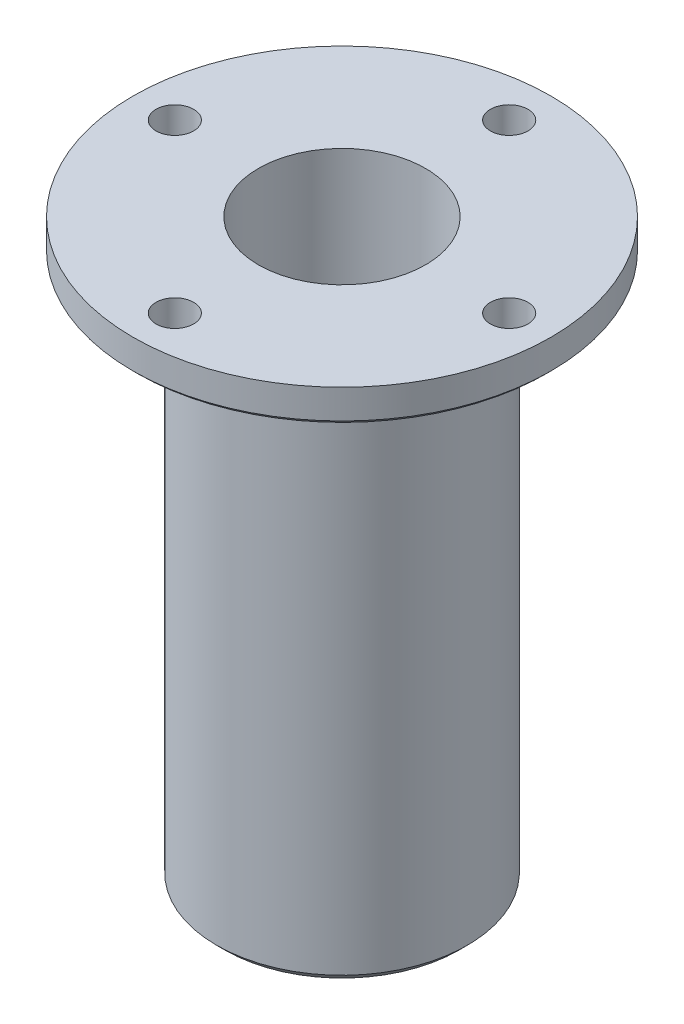
ISO-10303-21;
HEADER;
FILE_DESCRIPTION(('STEP AP214'),'2;1');
FILE_NAME('part.step','',(''),(''),'','','');
FILE_SCHEMA(('AUTOMOTIVE_DESIGN { 1 0 10303 214 1 1 1 1 }'));
ENDSEC;
DATA;
#1=APPLICATION_CONTEXT('core data for automotive mechanical design processes');
#2=APPLICATION_PROTOCOL_DEFINITION('international standard','automotive_design',2000,#1);
#3=PRODUCT_CONTEXT('',#1,'mechanical');
#4=PRODUCT('Part','Part','',(#3));
#5=PRODUCT_RELATED_PRODUCT_CATEGORY('part','',(#4));
#6=PRODUCT_DEFINITION_FORMATION('','',#4);
#7=PRODUCT_DEFINITION_CONTEXT('part definition',#1,'design');
#8=PRODUCT_DEFINITION('design','',#6,#7);
#9=PRODUCT_DEFINITION_SHAPE('','',#8);
#10=(LENGTH_UNIT() NAMED_UNIT(*) SI_UNIT(.MILLI.,.METRE.));
#11=(NAMED_UNIT(*) PLANE_ANGLE_UNIT() SI_UNIT($,.RADIAN.));
#12=(NAMED_UNIT(*) SI_UNIT($,.STERADIAN.) SOLID_ANGLE_UNIT());
#13=UNCERTAINTY_MEASURE_WITH_UNIT(LENGTH_MEASURE(1.E-05),#10,'distance_accuracy_value','');
#14=(GEOMETRIC_REPRESENTATION_CONTEXT(3) GLOBAL_UNCERTAINTY_ASSIGNED_CONTEXT((#13)) GLOBAL_UNIT_ASSIGNED_CONTEXT((#10,
#11,#12)) REPRESENTATION_CONTEXT('',''));
#15=CARTESIAN_POINT('',(0.,0.,0.));
#16=DIRECTION('',(0.,0.,1.));
#17=DIRECTION('',(1.,0.,0.));
#18=AXIS2_PLACEMENT_3D('',#15,#16,#17);
#19=CARTESIAN_POINT('',(0.,0.,0.));
#20=DIRECTION('',(0.,1.,0.));
#21=DIRECTION('',(0.,0.,1.00000000000001));
#22=AXIS2_PLACEMENT_3D('',#19,#20,#21);
#23=PLANE('',#22);
#24=CARTESIAN_POINT('',(0.,0.,0.));
#25=DIRECTION('',(0.,1.,0.));
#26=DIRECTION('',(0.,0.,1.00000000000001));
#27=AXIS2_PLACEMENT_3D('',#24,#25,#26);
#28=CIRCLE('',#27,14.);
#29=CARTESIAN_POINT('',(0.,0.,14.0000000000001));
#30=VERTEX_POINT('',#29);
#31=EDGE_CURVE('E67',#30,#30,#28,.F.);
#32=ORIENTED_EDGE('',*,*,#31,.T.);
#33=EDGE_LOOP('',(#32));
#34=FACE_BOUND('',#33,.T.);
#35=CARTESIAN_POINT('',(12.5000000000002,0.,0.));
#36=DIRECTION('',(0.,-1.,0.));
#37=DIRECTION('',(0.,0.,-1.00000000000001));
#38=AXIS2_PLACEMENT_3D('',#35,#36,#37);
#39=CIRCLE('',#38,1.4);
#40=CARTESIAN_POINT('',(12.5000000000002,0.,-1.40000000000001));
#41=VERTEX_POINT('',#40);
#42=EDGE_CURVE('E125',#41,#41,#39,.T.);
#43=ORIENTED_EDGE('',*,*,#42,.F.);
#44=EDGE_LOOP('',(#43));
#45=FACE_BOUND('',#44,.T.);
#46=CARTESIAN_POINT('',(0.,0.,-12.5000000000001));
#47=DIRECTION('',(0.,-1.,0.));
#48=DIRECTION('',(0.,0.,-1.00000000000001));
#49=AXIS2_PLACEMENT_3D('',#46,#47,#48);
#50=CIRCLE('',#49,1.4);
#51=CARTESIAN_POINT('',(0.,0.,-13.9000000000001));
#52=VERTEX_POINT('',#51);
#53=EDGE_CURVE('E119',#52,#52,#50,.T.);
#54=ORIENTED_EDGE('',*,*,#53,.F.);
#55=EDGE_LOOP('',(#54));
#56=FACE_BOUND('',#55,.T.);
#57=CARTESIAN_POINT('',(-12.5000000000002,0.,0.));
#58=DIRECTION('',(0.,-1.,0.));
#59=DIRECTION('',(0.,0.,-1.00000000000001));
#60=AXIS2_PLACEMENT_3D('',#57,#58,#59);
#61=CIRCLE('',#60,1.4);
#62=CARTESIAN_POINT('',(-12.5000000000002,0.,-1.40000000000001));
#63=VERTEX_POINT('',#62);
#64=EDGE_CURVE('E113',#63,#63,#61,.T.);
#65=ORIENTED_EDGE('',*,*,#64,.F.);
#66=EDGE_LOOP('',(#65));
#67=FACE_BOUND('',#66,.T.);
#68=CARTESIAN_POINT('',(0.,0.,12.5000000000001));
#69=DIRECTION('',(0.,-1.,0.));
#70=DIRECTION('',(0.,0.,-1.00000000000001));
#71=AXIS2_PLACEMENT_3D('',#68,#69,#70);
#72=CIRCLE('',#71,1.4);
#73=CARTESIAN_POINT('',(0.,0.,11.1000000000001));
#74=VERTEX_POINT('',#73);
#75=EDGE_CURVE('E107',#74,#74,#72,.T.);
#76=ORIENTED_EDGE('',*,*,#75,.F.);
#77=EDGE_LOOP('',(#76));
#78=FACE_BOUND('',#77,.T.);
#79=CARTESIAN_POINT('',(0.,0.,0.));
#80=DIRECTION('',(0.,1.,0.));
#81=DIRECTION('',(0.,0.,1.00000000000001));
#82=AXIS2_PLACEMENT_3D('',#79,#80,#81);
#83=CIRCLE('',#82,10.);
#84=CARTESIAN_POINT('',(0.,0.,10.0000000000001));
#85=VERTEX_POINT('',#84);
#86=EDGE_CURVE('E73',#85,#85,#83,.T.);
#87=ORIENTED_EDGE('',*,*,#86,.T.);
#88=EDGE_LOOP('',(#87));
#89=FACE_BOUND('',#88,.T.);
#90=ADVANCED_FACE('F47',(#34,#45,#56,#67,#78,#89),#23,.F.);
#91=CARTESIAN_POINT('',(0.,65.,0.));
#92=DIRECTION('',(0.,-1.,0.));
#93=DIRECTION('',(0.,0.,-1.00000000000001));
#94=AXIS2_PLACEMENT_3D('',#91,#92,#93);
#95=CYLINDRICAL_SURFACE('',#94,15.);
#96=CARTESIAN_POINT('',(0.,64.5,0.));
#97=DIRECTION('',(0.,1.,0.));
#98=DIRECTION('',(0.,0.,1.00000000000001));
#99=AXIS2_PLACEMENT_3D('',#96,#97,#98);
#100=CIRCLE('',#99,15.);
#101=CARTESIAN_POINT('',(0.,64.5,15.0000000000002));
#102=VERTEX_POINT('',#101);
#103=EDGE_CURVE('E10',#102,#102,#100,.F.);
#104=ORIENTED_EDGE('',*,*,#103,.T.);
#105=EDGE_LOOP('',(#104));
#106=FACE_BOUND('',#105,.T.);
#107=CARTESIAN_POINT('',(0.,1.00000000000001,0.));
#108=DIRECTION('',(0.,1.,0.));
#109=DIRECTION('',(0.,0.,1.00000000000001));
#110=AXIS2_PLACEMENT_3D('',#107,#108,#109);
#111=CIRCLE('',#110,15.);
#112=CARTESIAN_POINT('',(0.,1.00000000000001,15.0000000000002));
#113=VERTEX_POINT('',#112);
#114=EDGE_CURVE('E70',#113,#113,#111,.T.);
#115=ORIENTED_EDGE('',*,*,#114,.T.);
#116=EDGE_LOOP('',(#115));
#117=FACE_BOUND('',#116,.T.);
#118=ADVANCED_FACE('F142',(#106,#117),#95,.T.);
#119=CARTESIAN_POINT('',(0.,65.,0.));
#120=DIRECTION('',(0.,-1.,0.));
#121=DIRECTION('',(0.,0.,-1.00000000000001));
#122=AXIS2_PLACEMENT_3D('',#119,#120,#121);
#123=CYLINDRICAL_SURFACE('',#122,10.);
#124=ORIENTED_EDGE('',*,*,#86,.F.);
#125=EDGE_LOOP('',(#124));
#126=FACE_BOUND('',#125,.T.);
#127=CARTESIAN_POINT('',(0.,69.,0.));
#128=DIRECTION('',(0.,1.,0.));
#129=DIRECTION('',(0.,0.,1.00000000000001));
#130=AXIS2_PLACEMENT_3D('',#127,#128,#129);
#131=CIRCLE('',#130,10.);
#132=CARTESIAN_POINT('',(0.,69.,10.0000000000001));
#133=VERTEX_POINT('',#132);
#134=EDGE_CURVE('E79',#133,#133,#131,.T.);
#135=ORIENTED_EDGE('',*,*,#134,.T.);
#136=EDGE_LOOP('',(#135));
#137=FACE_BOUND('',#136,.T.);
#138=ADVANCED_FACE('F153',(#126,#137),#123,.F.);
#139=CARTESIAN_POINT('',(0.,69.,0.));
#140=DIRECTION('',(0.,1.,0.));
#141=DIRECTION('',(0.,0.,1.00000000000001));
#142=AXIS2_PLACEMENT_3D('',#139,#140,#141);
#143=PLANE('',#142);
#144=CARTESIAN_POINT('',(-20.0000000000002,69.,0.));
#145=DIRECTION('',(0.,1.,0.));
#146=DIRECTION('',(0.,0.,1.00000000000001));
#147=AXIS2_PLACEMENT_3D('',#144,#145,#146);
#148=CIRCLE('',#147,2.25);
#149=CARTESIAN_POINT('',(-20.0000000000002,69.,2.25000000000002));
#150=VERTEX_POINT('',#149);
#151=EDGE_CURVE('E92',#150,#150,#148,.T.);
#152=ORIENTED_EDGE('',*,*,#151,.F.);
#153=EDGE_LOOP('',(#152));
#154=FACE_BOUND('',#153,.T.);
#155=CARTESIAN_POINT('',(20.0000000000002,68.9999999999999,0.));
#156=DIRECTION('',(0.,1.,0.));
#157=DIRECTION('',(0.,0.,1.00000000000001));
#158=AXIS2_PLACEMENT_3D('',#155,#156,#157);
#159=CIRCLE('',#158,2.25);
#160=CARTESIAN_POINT('',(20.0000000000002,68.9999999999999,2.25000000000002));
#161=VERTEX_POINT('',#160);
#162=EDGE_CURVE('E82',#161,#161,#159,.T.);
#163=ORIENTED_EDGE('',*,*,#162,.F.);
#164=EDGE_LOOP('',(#163));
#165=FACE_BOUND('',#164,.T.);
#166=CARTESIAN_POINT('',(0.,69.,0.));
#167=DIRECTION('',(0.,1.,0.));
#168=DIRECTION('',(0.,0.,1.00000000000001));
#169=AXIS2_PLACEMENT_3D('',#166,#167,#168);
#170=CIRCLE('',#169,25.);
#171=CARTESIAN_POINT('',(0.,69.,25.0000000000003));
#172=VERTEX_POINT('',#171);
#173=EDGE_CURVE('E76',#172,#172,#170,.T.);
#174=ORIENTED_EDGE('',*,*,#173,.T.);
#175=EDGE_LOOP('',(#174));
#176=FACE_BOUND('',#175,.T.);
#177=ORIENTED_EDGE('',*,*,#134,.F.);
#178=EDGE_LOOP('',(#177));
#179=FACE_BOUND('',#178,.T.);
#180=CARTESIAN_POINT('',(0.,69.,20.));
#181=DIRECTION('',(0.,1.,0.));
#182=DIRECTION('',(0.,0.,1.00000000000001));
#183=AXIS2_PLACEMENT_3D('',#180,#181,#182);
#184=CIRCLE('',#183,2.25);
#185=CARTESIAN_POINT('',(0.,69.,22.2500000000001));
#186=VERTEX_POINT('',#185);
#187=EDGE_CURVE('E86',#186,#186,#184,.T.);
#188=ORIENTED_EDGE('',*,*,#187,.F.);
#189=EDGE_LOOP('',(#188));
#190=FACE_BOUND('',#189,.T.);
#191=CARTESIAN_POINT('',(0.,69.,-20.0000000000002));
#192=DIRECTION('',(0.,1.,0.));
#193=DIRECTION('',(0.,0.,1.00000000000001));
#194=AXIS2_PLACEMENT_3D('',#191,#192,#193);
#195=CIRCLE('',#194,2.25);
#196=CARTESIAN_POINT('',(0.,69.,-17.7500000000002));
#197=VERTEX_POINT('',#196);
#198=EDGE_CURVE('E98',#197,#197,#195,.T.);
#199=ORIENTED_EDGE('',*,*,#198,.F.);
#200=EDGE_LOOP('',(#199));
#201=FACE_BOUND('',#200,.T.);
#202=ADVANCED_FACE('F156',(#154,#165,#176,#179,#190,#201),#143,.T.);
#203=CARTESIAN_POINT('',(0.,65.,0.));
#204=DIRECTION('',(0.,1.,0.));
#205=DIRECTION('',(0.,0.,1.00000000000001));
#206=AXIS2_PLACEMENT_3D('',#203,#204,#205);
#207=PLANE('',#206);
#208=CARTESIAN_POINT('',(0.,65.,0.));
#209=DIRECTION('',(0.,1.,0.));
#210=DIRECTION('',(0.,0.,1.00000000000001));
#211=AXIS2_PLACEMENT_3D('',#208,#209,#210);
#212=CIRCLE('',#211,15.5);
#213=CARTESIAN_POINT('',(0.,65.,15.5000000000002));
#214=VERTEX_POINT('',#213);
#215=EDGE_CURVE('E54',#214,#214,#212,.T.);
#216=ORIENTED_EDGE('',*,*,#215,.T.);
#217=EDGE_LOOP('',(#216));
#218=FACE_BOUND('',#217,.T.);
#219=CARTESIAN_POINT('',(0.,65.,0.));
#220=DIRECTION('',(0.,1.,0.));
#221=DIRECTION('',(0.,0.,1.00000000000001));
#222=AXIS2_PLACEMENT_3D('',#219,#220,#221);
#223=CIRCLE('',#222,24.5);
#224=CARTESIAN_POINT('',(0.,65.,24.5000000000002));
#225=VERTEX_POINT('',#224);
#226=EDGE_CURVE('E58',#225,#225,#223,.F.);
#227=ORIENTED_EDGE('',*,*,#226,.T.);
#228=EDGE_LOOP('',(#227));
#229=FACE_BOUND('',#228,.T.);
#230=CARTESIAN_POINT('',(20.0000000000002,64.9999999999999,0.));
#231=DIRECTION('',(0.,1.,0.));
#232=DIRECTION('',(0.,0.,1.00000000000001));
#233=AXIS2_PLACEMENT_3D('',#230,#231,#232);
#234=CIRCLE('',#233,2.25);
#235=CARTESIAN_POINT('',(20.0000000000002,64.9999999999999,2.25000000000002));
#236=VERTEX_POINT('',#235);
#237=EDGE_CURVE('E83',#236,#236,#234,.T.);
#238=ORIENTED_EDGE('',*,*,#237,.T.);
#239=EDGE_LOOP('',(#238));
#240=FACE_BOUND('',#239,.T.);
#241=CARTESIAN_POINT('',(0.,65.,20.));
#242=DIRECTION('',(0.,1.,0.));
#243=DIRECTION('',(0.,0.,1.00000000000001));
#244=AXIS2_PLACEMENT_3D('',#241,#242,#243);
#245=CIRCLE('',#244,2.25);
#246=CARTESIAN_POINT('',(0.,65.,22.25));
#247=VERTEX_POINT('',#246);
#248=EDGE_CURVE('E89',#247,#247,#245,.T.);
#249=ORIENTED_EDGE('',*,*,#248,.T.);
#250=EDGE_LOOP('',(#249));
#251=FACE_BOUND('',#250,.T.);
#252=CARTESIAN_POINT('',(-20.0000000000002,65.,0.));
#253=DIRECTION('',(0.,1.,0.));
#254=DIRECTION('',(0.,0.,1.00000000000001));
#255=AXIS2_PLACEMENT_3D('',#252,#253,#254);
#256=CIRCLE('',#255,2.25);
#257=CARTESIAN_POINT('',(-20.0000000000002,65.,2.25000000000002));
#258=VERTEX_POINT('',#257);
#259=EDGE_CURVE('E95',#258,#258,#256,.T.);
#260=ORIENTED_EDGE('',*,*,#259,.T.);
#261=EDGE_LOOP('',(#260));
#262=FACE_BOUND('',#261,.T.);
#263=CARTESIAN_POINT('',(0.,65.,-20.0000000000002));
#264=DIRECTION('',(0.,1.,0.));
#265=DIRECTION('',(0.,0.,1.00000000000001));
#266=AXIS2_PLACEMENT_3D('',#263,#264,#265);
#267=CIRCLE('',#266,2.25);
#268=CARTESIAN_POINT('',(0.,65.,-17.7500000000002));
#269=VERTEX_POINT('',#268);
#270=EDGE_CURVE('E101',#269,#269,#267,.T.);
#271=ORIENTED_EDGE('',*,*,#270,.T.);
#272=EDGE_LOOP('',(#271));
#273=FACE_BOUND('',#272,.T.);
#274=ADVANCED_FACE('F162',(#218,#229,#240,#251,#262,#273),#207,.F.);
#275=CARTESIAN_POINT('',(0.,69.,0.));
#276=DIRECTION('',(0.,-1.,0.));
#277=DIRECTION('',(0.,0.,-1.00000000000001));
#278=AXIS2_PLACEMENT_3D('',#275,#276,#277);
#279=CYLINDRICAL_SURFACE('',#278,25.);
#280=CARTESIAN_POINT('',(0.,65.5,0.));
#281=DIRECTION('',(0.,1.,0.));
#282=DIRECTION('',(0.,0.,1.00000000000001));
#283=AXIS2_PLACEMENT_3D('',#280,#281,#282);
#284=CIRCLE('',#283,25.);
#285=CARTESIAN_POINT('',(0.,65.5,25.0000000000003));
#286=VERTEX_POINT('',#285);
#287=EDGE_CURVE('E62',#286,#286,#284,.T.);
#288=ORIENTED_EDGE('',*,*,#287,.T.);
#289=EDGE_LOOP('',(#288));
#290=FACE_BOUND('',#289,.T.);
#291=ORIENTED_EDGE('',*,*,#173,.F.);
#292=EDGE_LOOP('',(#291));
#293=FACE_BOUND('',#292,.T.);
#294=ADVANCED_FACE('F178',(#290,#293),#279,.T.);
#295=CARTESIAN_POINT('',(20.0000000000002,68.9999999999999,0.));
#296=DIRECTION('',(0.,-1.,0.));
#297=DIRECTION('',(0.,0.,-1.00000000000001));
#298=AXIS2_PLACEMENT_3D('',#295,#296,#297);
#299=CYLINDRICAL_SURFACE('',#298,2.25);
#300=ORIENTED_EDGE('',*,*,#162,.T.);
#301=EDGE_LOOP('',(#300));
#302=FACE_BOUND('',#301,.T.);
#303=ORIENTED_EDGE('',*,*,#237,.F.);
#304=EDGE_LOOP('',(#303));
#305=FACE_BOUND('',#304,.T.);
#306=ADVANCED_FACE('F183',(#302,#305),#299,.F.);
#307=CARTESIAN_POINT('',(0.,69.,20.));
#308=DIRECTION('',(0.,-1.,0.));
#309=DIRECTION('',(0.,0.,-1.00000000000001));
#310=AXIS2_PLACEMENT_3D('',#307,#308,#309);
#311=CYLINDRICAL_SURFACE('',#310,2.25);
#312=ORIENTED_EDGE('',*,*,#187,.T.);
#313=EDGE_LOOP('',(#312));
#314=FACE_BOUND('',#313,.T.);
#315=ORIENTED_EDGE('',*,*,#248,.F.);
#316=EDGE_LOOP('',(#315));
#317=FACE_BOUND('',#316,.T.);
#318=ADVANCED_FACE('F221',(#314,#317),#311,.F.);
#319=CARTESIAN_POINT('',(-20.0000000000002,69.,0.));
#320=DIRECTION('',(0.,-1.,0.));
#321=DIRECTION('',(0.,0.,-1.00000000000001));
#322=AXIS2_PLACEMENT_3D('',#319,#320,#321);
#323=CYLINDRICAL_SURFACE('',#322,2.25);
#324=ORIENTED_EDGE('',*,*,#151,.T.);
#325=EDGE_LOOP('',(#324));
#326=FACE_BOUND('',#325,.T.);
#327=ORIENTED_EDGE('',*,*,#259,.F.);
#328=EDGE_LOOP('',(#327));
#329=FACE_BOUND('',#328,.T.);
#330=ADVANCED_FACE('F173',(#326,#329),#323,.F.);
#331=CARTESIAN_POINT('',(0.,69.,-20.0000000000002));
#332=DIRECTION('',(0.,-1.,0.));
#333=DIRECTION('',(0.,0.,-1.00000000000001));
#334=AXIS2_PLACEMENT_3D('',#331,#332,#333);
#335=CYLINDRICAL_SURFACE('',#334,2.25);
#336=ORIENTED_EDGE('',*,*,#198,.T.);
#337=EDGE_LOOP('',(#336));
#338=FACE_BOUND('',#337,.T.);
#339=ORIENTED_EDGE('',*,*,#270,.F.);
#340=EDGE_LOOP('',(#339));
#341=FACE_BOUND('',#340,.T.);
#342=ADVANCED_FACE('F169',(#338,#341),#335,.F.);
#343=CARTESIAN_POINT('',(0.,20.,12.5000000000001));
#344=DIRECTION('',(0.,-1.,0.));
#345=DIRECTION('',(0.,0.,-1.00000000000001));
#346=AXIS2_PLACEMENT_3D('',#343,#344,#345);
#347=CYLINDRICAL_SURFACE('',#346,1.4);
#348=CARTESIAN_POINT('',(0.,20.,12.5000000000001));
#349=DIRECTION('',(0.,-1.,0.));
#350=DIRECTION('',(0.,0.,-1.00000000000001));
#351=AXIS2_PLACEMENT_3D('',#348,#349,#350);
#352=CIRCLE('',#351,1.4);
#353=CARTESIAN_POINT('',(0.,20.,11.1000000000001));
#354=VERTEX_POINT('',#353);
#355=EDGE_CURVE('E110',#354,#354,#352,.T.);
#356=ORIENTED_EDGE('',*,*,#355,.F.);
#357=EDGE_LOOP('',(#356));
#358=FACE_BOUND('',#357,.T.);
#359=ORIENTED_EDGE('',*,*,#75,.T.);
#360=EDGE_LOOP('',(#359));
#361=FACE_BOUND('',#360,.T.);
#362=ADVANCED_FACE('F172',(#358,#361),#347,.F.);
#363=CARTESIAN_POINT('',(0.,20.,12.5000000000001));
#364=DIRECTION('',(0.,-1.,0.));
#365=DIRECTION('',(0.,0.,-1.00000000000001));
#366=AXIS2_PLACEMENT_3D('',#363,#364,#365);
#367=PLANE('',#366);
#368=ORIENTED_EDGE('',*,*,#355,.T.);
#369=EDGE_LOOP('',(#368));
#370=FACE_BOUND('',#369,.T.);
#371=ADVANCED_FACE('F256',(#370),#367,.T.);
#372=CARTESIAN_POINT('',(-12.5000000000002,20.,0.));
#373=DIRECTION('',(0.,-1.,0.));
#374=DIRECTION('',(0.,0.,-1.00000000000001));
#375=AXIS2_PLACEMENT_3D('',#372,#373,#374);
#376=CYLINDRICAL_SURFACE('',#375,1.4);
#377=CARTESIAN_POINT('',(-12.5000000000002,20.,0.));
#378=DIRECTION('',(0.,-1.,0.));
#379=DIRECTION('',(0.,0.,-1.00000000000001));
#380=AXIS2_PLACEMENT_3D('',#377,#378,#379);
#381=CIRCLE('',#380,1.4);
#382=CARTESIAN_POINT('',(-12.5000000000002,20.,-1.40000000000001));
#383=VERTEX_POINT('',#382);
#384=EDGE_CURVE('E116',#383,#383,#381,.T.);
#385=ORIENTED_EDGE('',*,*,#384,.F.);
#386=EDGE_LOOP('',(#385));
#387=FACE_BOUND('',#386,.T.);
#388=ORIENTED_EDGE('',*,*,#64,.T.);
#389=EDGE_LOOP('',(#388));
#390=FACE_BOUND('',#389,.T.);
#391=ADVANCED_FACE('F263',(#387,#390),#376,.F.);
#392=CARTESIAN_POINT('',(-12.5000000000002,20.,0.));
#393=DIRECTION('',(0.,-1.,0.));
#394=DIRECTION('',(0.,0.,-1.00000000000001));
#395=AXIS2_PLACEMENT_3D('',#392,#393,#394);
#396=PLANE('',#395);
#397=ORIENTED_EDGE('',*,*,#384,.T.);
#398=EDGE_LOOP('',(#397));
#399=FACE_BOUND('',#398,.T.);
#400=ADVANCED_FACE('F271',(#399),#396,.T.);
#401=CARTESIAN_POINT('',(0.,20.,-12.5000000000001));
#402=DIRECTION('',(0.,-1.,0.));
#403=DIRECTION('',(0.,0.,-1.00000000000001));
#404=AXIS2_PLACEMENT_3D('',#401,#402,#403);
#405=CYLINDRICAL_SURFACE('',#404,1.4);
#406=CARTESIAN_POINT('',(0.,20.,-12.5000000000001));
#407=DIRECTION('',(0.,-1.,0.));
#408=DIRECTION('',(0.,0.,-1.00000000000001));
#409=AXIS2_PLACEMENT_3D('',#406,#407,#408);
#410=CIRCLE('',#409,1.4);
#411=CARTESIAN_POINT('',(0.,20.,-13.9000000000001));
#412=VERTEX_POINT('',#411);
#413=EDGE_CURVE('E122',#412,#412,#410,.T.);
#414=ORIENTED_EDGE('',*,*,#413,.F.);
#415=EDGE_LOOP('',(#414));
#416=FACE_BOUND('',#415,.T.);
#417=ORIENTED_EDGE('',*,*,#53,.T.);
#418=EDGE_LOOP('',(#417));
#419=FACE_BOUND('',#418,.T.);
#420=ADVANCED_FACE('F279',(#416,#419),#405,.F.);
#421=CARTESIAN_POINT('',(0.,20.,-12.5000000000001));
#422=DIRECTION('',(0.,-1.,0.));
#423=DIRECTION('',(0.,0.,-1.00000000000001));
#424=AXIS2_PLACEMENT_3D('',#421,#422,#423);
#425=PLANE('',#424);
#426=ORIENTED_EDGE('',*,*,#413,.T.);
#427=EDGE_LOOP('',(#426));
#428=FACE_BOUND('',#427,.T.);
#429=ADVANCED_FACE('F136',(#428),#425,.T.);
#430=CARTESIAN_POINT('',(12.5000000000002,20.,0.));
#431=DIRECTION('',(0.,-1.,0.));
#432=DIRECTION('',(0.,0.,-1.00000000000001));
#433=AXIS2_PLACEMENT_3D('',#430,#431,#432);
#434=CYLINDRICAL_SURFACE('',#433,1.4);
#435=CARTESIAN_POINT('',(12.5000000000002,20.,0.));
#436=DIRECTION('',(0.,-1.,0.));
#437=DIRECTION('',(0.,0.,-1.00000000000001));
#438=AXIS2_PLACEMENT_3D('',#435,#436,#437);
#439=CIRCLE('',#438,1.4);
#440=CARTESIAN_POINT('',(12.5000000000002,20.,-1.40000000000001));
#441=VERTEX_POINT('',#440);
#442=EDGE_CURVE('E104',#441,#441,#439,.T.);
#443=ORIENTED_EDGE('',*,*,#442,.F.);
#444=EDGE_LOOP('',(#443));
#445=FACE_BOUND('',#444,.T.);
#446=ORIENTED_EDGE('',*,*,#42,.T.);
#447=EDGE_LOOP('',(#446));
#448=FACE_BOUND('',#447,.T.);
#449=ADVANCED_FACE('F133',(#445,#448),#434,.F.);
#450=CARTESIAN_POINT('',(12.5000000000002,20.,0.));
#451=DIRECTION('',(0.,-1.,0.));
#452=DIRECTION('',(0.,0.,-1.00000000000001));
#453=AXIS2_PLACEMENT_3D('',#450,#451,#452);
#454=PLANE('',#453);
#455=ORIENTED_EDGE('',*,*,#442,.T.);
#456=EDGE_LOOP('',(#455));
#457=FACE_BOUND('',#456,.T.);
#458=ADVANCED_FACE('F131',(#457),#454,.T.);
#459=CARTESIAN_POINT('',(0.,1.00000000000001,0.));
#460=DIRECTION('',(0.,1.,0.));
#461=DIRECTION('',(0.,0.,1.00000000000001));
#462=AXIS2_PLACEMENT_3D('',#459,#460,#461);
#463=CONICAL_SURFACE('',#462,15.,0.785398163397451);
#464=ORIENTED_EDGE('',*,*,#31,.F.);
#465=EDGE_LOOP('',(#464));
#466=FACE_BOUND('',#465,.T.);
#467=ORIENTED_EDGE('',*,*,#114,.F.);
#468=EDGE_LOOP('',(#467));
#469=FACE_BOUND('',#468,.T.);
#470=ADVANCED_FACE('F192',(#466,#469),#463,.T.);
#471=CARTESIAN_POINT('',(0.,65.5,0.));
#472=DIRECTION('',(0.,1.,0.));
#473=DIRECTION('',(0.,0.,1.00000000000001));
#474=AXIS2_PLACEMENT_3D('',#471,#472,#473);
#475=CONICAL_SURFACE('',#474,25.,0.785398163397448);
#476=ORIENTED_EDGE('',*,*,#226,.F.);
#477=EDGE_LOOP('',(#476));
#478=FACE_BOUND('',#477,.T.);
#479=ORIENTED_EDGE('',*,*,#287,.F.);
#480=EDGE_LOOP('',(#479));
#481=FACE_BOUND('',#480,.T.);
#482=ADVANCED_FACE('F197',(#478,#481),#475,.T.);
#483=CARTESIAN_POINT('',(0.,64.5,0.));
#484=DIRECTION('',(0.,1.,0.));
#485=DIRECTION('',(0.,0.,1.00000000000001));
#486=AXIS2_PLACEMENT_3D('',#483,#484,#485);
#487=TOROIDAL_SURFACE('',#486,15.5,0.5);
#488=ORIENTED_EDGE('',*,*,#103,.F.);
#489=EDGE_LOOP('',(#488));
#490=FACE_BOUND('',#489,.T.);
#491=ORIENTED_EDGE('',*,*,#215,.F.);
#492=EDGE_LOOP('',(#491));
#493=FACE_BOUND('',#492,.T.);
#494=ADVANCED_FACE('F49',(#490,#493),#487,.F.);
#495=CLOSED_SHELL('',(#90,#118,#138,#202,#274,#294,#306,#318,#330,#342,#362,#371,#391,#400,#420,
#429,#449,#458,#470,#482,#494));
#496=MANIFOLD_SOLID_BREP('B2',#495);
#497=ADVANCED_BREP_SHAPE_REPRESENTATION('',(#18,#496),#14);
#498=SHAPE_DEFINITION_REPRESENTATION(#9,#497);
ENDSEC;
END-ISO-10303-21;
